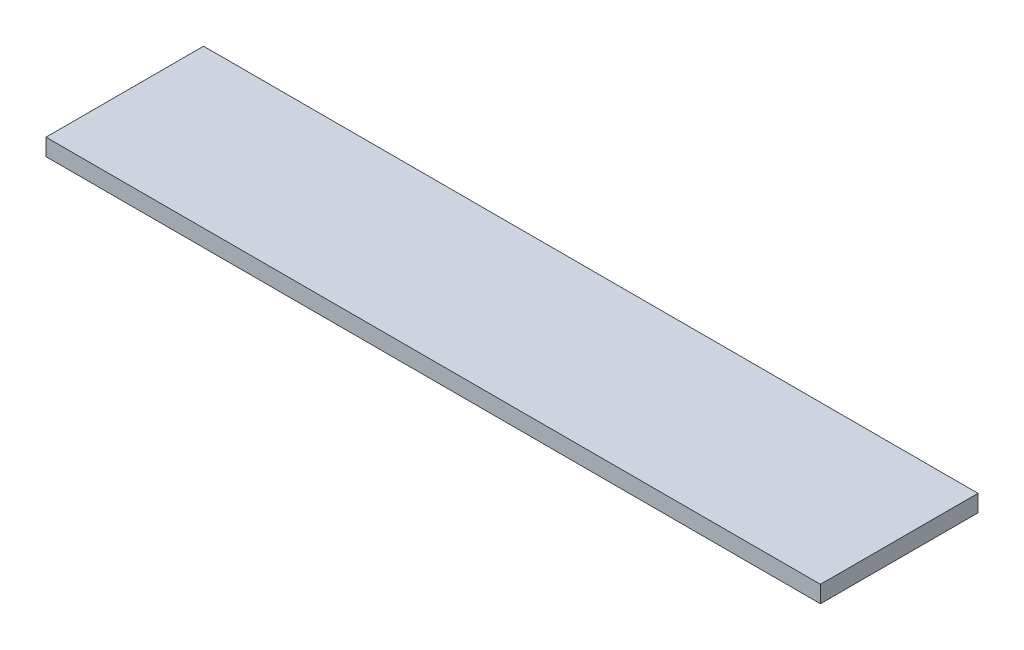
ISO-10303-21;
HEADER;
FILE_DESCRIPTION(('STEP AP214'),'2;1');
FILE_NAME('part.step','',(''),(''),'','','');
FILE_SCHEMA(('AUTOMOTIVE_DESIGN { 1 0 10303 214 1 1 1 1 }'));
ENDSEC;
DATA;
#1=APPLICATION_CONTEXT('core data for automotive mechanical design processes');
#2=APPLICATION_PROTOCOL_DEFINITION('international standard','automotive_design',2000,#1);
#3=PRODUCT_CONTEXT('',#1,'mechanical');
#4=PRODUCT('Part','Part','',(#3));
#5=PRODUCT_RELATED_PRODUCT_CATEGORY('part','',(#4));
#6=PRODUCT_DEFINITION_FORMATION('','',#4);
#7=PRODUCT_DEFINITION_CONTEXT('part definition',#1,'design');
#8=PRODUCT_DEFINITION('design','',#6,#7);
#9=PRODUCT_DEFINITION_SHAPE('','',#8);
#10=(LENGTH_UNIT() NAMED_UNIT(*) SI_UNIT(.MILLI.,.METRE.));
#11=(NAMED_UNIT(*) PLANE_ANGLE_UNIT() SI_UNIT($,.RADIAN.));
#12=(NAMED_UNIT(*) SI_UNIT($,.STERADIAN.) SOLID_ANGLE_UNIT());
#13=UNCERTAINTY_MEASURE_WITH_UNIT(LENGTH_MEASURE(1.E-05),#10,'distance_accuracy_value','');
#14=(GEOMETRIC_REPRESENTATION_CONTEXT(3) GLOBAL_UNCERTAINTY_ASSIGNED_CONTEXT((#13)) GLOBAL_UNIT_ASSIGNED_CONTEXT((#10,
#11,#12)) REPRESENTATION_CONTEXT('',''));
#15=CARTESIAN_POINT('',(0.,0.,0.));
#16=DIRECTION('',(0.,0.,1.));
#17=DIRECTION('',(1.,0.,0.));
#18=AXIS2_PLACEMENT_3D('',#15,#16,#17);
#19=CARTESIAN_POINT('',(-81.7095459814149,6.,28.9897015775721));
#20=DIRECTION('',(1.,0.,0.));
#21=DIRECTION('',(0.,0.,-1.));
#22=AXIS2_PLACEMENT_3D('',#19,#20,#21);
#23=PLANE('',#22);
#24=DIRECTION('',(0.,0.,1.));
#25=VECTOR('',#24,1.);
#26=CARTESIAN_POINT('',(-81.7095459814149,0.,28.9897015775721));
#27=LINE('',#26,#25);
#28=CARTESIAN_POINT('',(-81.7095459814149,0.,-26.9284585977097));
#29=VERTEX_POINT('',#28);
#30=CARTESIAN_POINT('',(-81.7095459814149,0.,28.9897015775721));
#31=VERTEX_POINT('',#30);
#32=EDGE_CURVE('E100',#29,#31,#27,.T.);
#33=ORIENTED_EDGE('',*,*,#32,.T.);
#34=DIRECTION('',(0.,-1.,0.));
#35=VECTOR('',#34,1.);
#36=CARTESIAN_POINT('',(-81.7095459814149,6.,28.9897015775721));
#37=LINE('',#36,#35);
#38=CARTESIAN_POINT('',(-81.7095459814149,6.,28.9897015775721));
#39=VERTEX_POINT('',#38);
#40=EDGE_CURVE('E11',#39,#31,#37,.T.);
#41=ORIENTED_EDGE('',*,*,#40,.F.);
#42=DIRECTION('',(0.,0.,1.));
#43=VECTOR('',#42,1.);
#44=CARTESIAN_POINT('',(-81.7095459814149,6.,28.9897015775721));
#45=LINE('',#44,#43);
#46=CARTESIAN_POINT('',(-81.7095459814149,6.,-26.9284585977097));
#47=VERTEX_POINT('',#46);
#48=EDGE_CURVE('E88',#47,#39,#45,.T.);
#49=ORIENTED_EDGE('',*,*,#48,.F.);
#50=DIRECTION('',(0.,-1.,0.));
#51=VECTOR('',#50,1.);
#52=CARTESIAN_POINT('',(-81.7095459814149,6.,-26.9284585977097));
#53=LINE('',#52,#51);
#54=EDGE_CURVE('E96',#47,#29,#53,.T.);
#55=ORIENTED_EDGE('',*,*,#54,.T.);
#56=EDGE_LOOP('',(#33,#41,#49,#55));
#57=FACE_BOUND('',#56,.T.);
#58=ADVANCED_FACE('F37',(#57),#23,.F.);
#59=CARTESIAN_POINT('',(193.158371213337,6.,28.9897015775721));
#60=DIRECTION('',(0.,0.,-1.));
#61=DIRECTION('',(-1.,0.,0.));
#62=AXIS2_PLACEMENT_3D('',#59,#60,#61);
#63=PLANE('',#62);
#64=DIRECTION('',(1.,0.,0.));
#65=VECTOR('',#64,1.);
#66=CARTESIAN_POINT('',(193.158371213337,0.,28.9897015775721));
#67=LINE('',#66,#65);
#68=CARTESIAN_POINT('',(193.158371213337,0.,28.9897015775721));
#69=VERTEX_POINT('',#68);
#70=EDGE_CURVE('E92',#31,#69,#67,.T.);
#71=ORIENTED_EDGE('',*,*,#70,.T.);
#72=DIRECTION('',(0.,-1.,0.));
#73=VECTOR('',#72,1.);
#74=CARTESIAN_POINT('',(193.158371213337,6.,28.9897015775721));
#75=LINE('',#74,#73);
#76=CARTESIAN_POINT('',(193.158371213337,6.,28.9897015775721));
#77=VERTEX_POINT('',#76);
#78=EDGE_CURVE('E45',#77,#69,#75,.T.);
#79=ORIENTED_EDGE('',*,*,#78,.F.);
#80=DIRECTION('',(1.,0.,0.));
#81=VECTOR('',#80,1.);
#82=CARTESIAN_POINT('',(193.158371213337,6.,28.9897015775721));
#83=LINE('',#82,#81);
#84=EDGE_CURVE('E83',#39,#77,#83,.T.);
#85=ORIENTED_EDGE('',*,*,#84,.F.);
#86=ORIENTED_EDGE('',*,*,#40,.T.);
#87=EDGE_LOOP('',(#71,#79,#85,#86));
#88=FACE_BOUND('',#87,.T.);
#89=ADVANCED_FACE('F91',(#88),#63,.F.);
#90=CARTESIAN_POINT('',(193.158371213337,6.,-26.9284585977097));
#91=DIRECTION('',(-1.,0.,0.));
#92=DIRECTION('',(0.,0.,1.));
#93=AXIS2_PLACEMENT_3D('',#90,#91,#92);
#94=PLANE('',#93);
#95=DIRECTION('',(0.,0.,-1.));
#96=VECTOR('',#95,1.);
#97=CARTESIAN_POINT('',(193.158371213337,0.,-26.9284585977097));
#98=LINE('',#97,#96);
#99=CARTESIAN_POINT('',(193.158371213337,0.,-26.9284585977097));
#100=VERTEX_POINT('',#99);
#101=EDGE_CURVE('E70',#69,#100,#98,.T.);
#102=ORIENTED_EDGE('',*,*,#101,.T.);
#103=DIRECTION('',(0.,-1.,0.));
#104=VECTOR('',#103,1.);
#105=CARTESIAN_POINT('',(193.158371213337,6.,-26.9284585977097));
#106=LINE('',#105,#104);
#107=CARTESIAN_POINT('',(193.158371213337,6.,-26.9284585977097));
#108=VERTEX_POINT('',#107);
#109=EDGE_CURVE('E93',#108,#100,#106,.T.);
#110=ORIENTED_EDGE('',*,*,#109,.F.);
#111=DIRECTION('',(0.,0.,-1.));
#112=VECTOR('',#111,1.);
#113=CARTESIAN_POINT('',(193.158371213337,6.,-26.9284585977097));
#114=LINE('',#113,#112);
#115=EDGE_CURVE('E86',#77,#108,#114,.T.);
#116=ORIENTED_EDGE('',*,*,#115,.F.);
#117=ORIENTED_EDGE('',*,*,#78,.T.);
#118=EDGE_LOOP('',(#102,#110,#116,#117));
#119=FACE_BOUND('',#118,.T.);
#120=ADVANCED_FACE('F94',(#119),#94,.F.);
#121=CARTESIAN_POINT('',(-81.7095459814149,6.,-26.9284585977097));
#122=DIRECTION('',(0.,0.,1.));
#123=DIRECTION('',(1.,0.,0.));
#124=AXIS2_PLACEMENT_3D('',#121,#122,#123);
#125=PLANE('',#124);
#126=DIRECTION('',(-1.,0.,0.));
#127=VECTOR('',#126,1.);
#128=CARTESIAN_POINT('',(-81.7095459814149,0.,-26.9284585977097));
#129=LINE('',#128,#127);
#130=EDGE_CURVE('E76',#100,#29,#129,.T.);
#131=ORIENTED_EDGE('',*,*,#130,.T.);
#132=ORIENTED_EDGE('',*,*,#54,.F.);
#133=DIRECTION('',(-1.,0.,0.));
#134=VECTOR('',#133,1.);
#135=CARTESIAN_POINT('',(-81.7095459814149,6.,-26.9284585977097));
#136=LINE('',#135,#134);
#137=EDGE_CURVE('E53',#108,#47,#136,.T.);
#138=ORIENTED_EDGE('',*,*,#137,.F.);
#139=ORIENTED_EDGE('',*,*,#109,.T.);
#140=EDGE_LOOP('',(#131,#132,#138,#139));
#141=FACE_BOUND('',#140,.T.);
#142=ADVANCED_FACE('F107',(#141),#125,.F.);
#143=CARTESIAN_POINT('',(0.,6.,0.));
#144=DIRECTION('',(0.,-1.,0.));
#145=DIRECTION('',(0.,0.,-1.));
#146=AXIS2_PLACEMENT_3D('',#143,#144,#145);
#147=PLANE('',#146);
#148=ORIENTED_EDGE('',*,*,#48,.T.);
#149=ORIENTED_EDGE('',*,*,#84,.T.);
#150=ORIENTED_EDGE('',*,*,#115,.T.);
#151=ORIENTED_EDGE('',*,*,#137,.T.);
#152=EDGE_LOOP('',(#148,#149,#150,#151));
#153=FACE_BOUND('',#152,.T.);
#154=ADVANCED_FACE('F84',(#153),#147,.F.);
#155=CARTESIAN_POINT('',(0.,0.,0.));
#156=DIRECTION('',(0.,-1.,0.));
#157=DIRECTION('',(0.,0.,-1.));
#158=AXIS2_PLACEMENT_3D('',#155,#156,#157);
#159=PLANE('',#158);
#160=ORIENTED_EDGE('',*,*,#32,.F.);
#161=ORIENTED_EDGE('',*,*,#130,.F.);
#162=ORIENTED_EDGE('',*,*,#101,.F.);
#163=ORIENTED_EDGE('',*,*,#70,.F.);
#164=EDGE_LOOP('',(#160,#161,#162,#163));
#165=FACE_BOUND('',#164,.T.);
#166=ADVANCED_FACE('F110',(#165),#159,.T.);
#167=CLOSED_SHELL('',(#58,#89,#120,#142,#154,#166));
#168=MANIFOLD_SOLID_BREP('B2',#167);
#169=ADVANCED_BREP_SHAPE_REPRESENTATION('',(#18,#168),#14);
#170=SHAPE_DEFINITION_REPRESENTATION(#9,#169);
ENDSEC;
END-ISO-10303-21;
